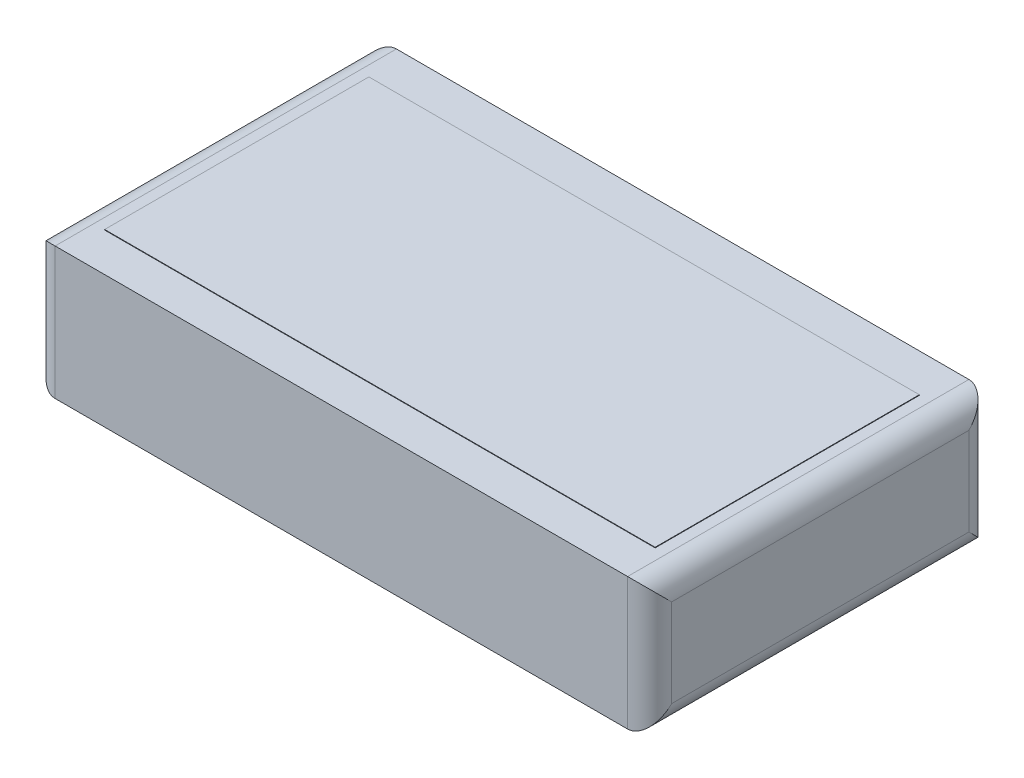
ISO-10303-21;
HEADER;
FILE_DESCRIPTION(('STEP AP214'),'2;1');
FILE_NAME('part.step','',(''),(''),'','','');
FILE_SCHEMA(('AUTOMOTIVE_DESIGN { 1 0 10303 214 1 1 1 1 }'));
ENDSEC;
DATA;
#1=APPLICATION_CONTEXT('core data for automotive mechanical design processes');
#2=APPLICATION_PROTOCOL_DEFINITION('international standard','automotive_design',2000,#1);
#3=PRODUCT_CONTEXT('',#1,'mechanical');
#4=PRODUCT('Part','Part','',(#3));
#5=PRODUCT_RELATED_PRODUCT_CATEGORY('part','',(#4));
#6=PRODUCT_DEFINITION_FORMATION('','',#4);
#7=PRODUCT_DEFINITION_CONTEXT('part definition',#1,'design');
#8=PRODUCT_DEFINITION('design','',#6,#7);
#9=PRODUCT_DEFINITION_SHAPE('','',#8);
#10=(LENGTH_UNIT() NAMED_UNIT(*) SI_UNIT(.MILLI.,.METRE.));
#11=(NAMED_UNIT(*) PLANE_ANGLE_UNIT() SI_UNIT($,.RADIAN.));
#12=(NAMED_UNIT(*) SI_UNIT($,.STERADIAN.) SOLID_ANGLE_UNIT());
#13=UNCERTAINTY_MEASURE_WITH_UNIT(LENGTH_MEASURE(1.E-05),#10,'distance_accuracy_value','');
#14=(GEOMETRIC_REPRESENTATION_CONTEXT(3) GLOBAL_UNCERTAINTY_ASSIGNED_CONTEXT((#13)) GLOBAL_UNIT_ASSIGNED_CONTEXT((#10,
#11,#12)) REPRESENTATION_CONTEXT('',''));
#15=CARTESIAN_POINT('',(0.,0.,0.));
#16=DIRECTION('',(0.,0.,1.));
#17=DIRECTION('',(1.,0.,0.));
#18=AXIS2_PLACEMENT_3D('',#15,#16,#17);
#19=CARTESIAN_POINT('',(-28.,6.,31.));
#20=DIRECTION('',(0.,-1.,0.));
#21=DIRECTION('',(0.,0.,-1.));
#22=AXIS2_PLACEMENT_3D('',#19,#20,#21);
#23=PLANE('',#22);
#24=DIRECTION('',(-1.,0.,0.));
#25=VECTOR('',#24,1.);
#26=CARTESIAN_POINT('',(-28.,6.,0.));
#27=LINE('',#26,#25);
#28=CARTESIAN_POINT('',(26.,6.,0.));
#29=VERTEX_POINT('',#28);
#30=CARTESIAN_POINT('',(-26.,6.,0.));
#31=VERTEX_POINT('',#30);
#32=EDGE_CURVE('E153',#29,#31,#27,.T.);
#33=ORIENTED_EDGE('',*,*,#32,.T.);
#34=DIRECTION('',(0.,0.,-1.));
#35=VECTOR('',#34,1.);
#36=CARTESIAN_POINT('',(-26.,6.,31.));
#37=LINE('',#36,#35);
#38=CARTESIAN_POINT('',(-26.,6.,31.));
#39=VERTEX_POINT('',#38);
#40=EDGE_CURVE('E206',#31,#39,#37,.F.);
#41=ORIENTED_EDGE('',*,*,#40,.T.);
#42=DIRECTION('',(-1.,0.,0.));
#43=VECTOR('',#42,1.);
#44=CARTESIAN_POINT('',(-28.,6.,31.));
#45=LINE('',#44,#43);
#46=CARTESIAN_POINT('',(26.,6.,31.));
#47=VERTEX_POINT('',#46);
#48=EDGE_CURVE('E162',#47,#39,#45,.T.);
#49=ORIENTED_EDGE('',*,*,#48,.F.);
#50=DIRECTION('',(0.,0.,-1.));
#51=VECTOR('',#50,1.);
#52=CARTESIAN_POINT('',(26.,6.,31.));
#53=LINE('',#52,#51);
#54=EDGE_CURVE('E181',#47,#29,#53,.T.);
#55=ORIENTED_EDGE('',*,*,#54,.T.);
#56=EDGE_LOOP('',(#33,#41,#49,#55));
#57=FACE_BOUND('',#56,.T.);
#58=DIRECTION('',(0.,0.,1.));
#59=VECTOR('',#58,1.);
#60=CARTESIAN_POINT('',(-25.,6.,3.5));
#61=LINE('',#60,#59);
#62=CARTESIAN_POINT('',(-25.,6.,3.5));
#63=VERTEX_POINT('',#62);
#64=CARTESIAN_POINT('',(-25.,6.,27.5));
#65=VERTEX_POINT('',#64);
#66=EDGE_CURVE('E152',#63,#65,#61,.T.);
#67=ORIENTED_EDGE('',*,*,#66,.F.);
#68=DIRECTION('',(-1.,0.,0.));
#69=VECTOR('',#68,1.);
#70=CARTESIAN_POINT('',(-25.,6.,3.5));
#71=LINE('',#70,#69);
#72=CARTESIAN_POINT('',(25.,6.,3.5));
#73=VERTEX_POINT('',#72);
#74=EDGE_CURVE('E149',#73,#63,#71,.T.);
#75=ORIENTED_EDGE('',*,*,#74,.F.);
#76=DIRECTION('',(0.,0.,-1.));
#77=VECTOR('',#76,1.);
#78=CARTESIAN_POINT('',(25.,6.,3.5));
#79=LINE('',#78,#77);
#80=CARTESIAN_POINT('',(25.,6.,27.5));
#81=VERTEX_POINT('',#80);
#82=EDGE_CURVE('E426',#81,#73,#79,.T.);
#83=ORIENTED_EDGE('',*,*,#82,.F.);
#84=DIRECTION('',(1.,0.,0.));
#85=VECTOR('',#84,1.);
#86=CARTESIAN_POINT('',(-25.,6.,27.5));
#87=LINE('',#86,#85);
#88=EDGE_CURVE('E428',#65,#81,#87,.T.);
#89=ORIENTED_EDGE('',*,*,#88,.F.);
#90=EDGE_LOOP('',(#67,#75,#83,#89));
#91=FACE_BOUND('',#90,.T.);
#92=ADVANCED_FACE('F38',(#57,#91),#23,.F.);
#93=CARTESIAN_POINT('',(28.,6.,31.));
#94=DIRECTION('',(-1.,0.,0.));
#95=DIRECTION('',(0.,0.,1.));
#96=AXIS2_PLACEMENT_3D('',#93,#94,#95);
#97=PLANE('',#96);
#98=DIRECTION('',(0.,1.,0.));
#99=VECTOR('',#98,1.);
#100=CARTESIAN_POINT('',(28.,6.,29.));
#101=LINE('',#100,#99);
#102=CARTESIAN_POINT('',(28.,4.,29.));
#103=VERTEX_POINT('',#102);
#104=CARTESIAN_POINT('',(28.,-4.,29.));
#105=VERTEX_POINT('',#104);
#106=EDGE_CURVE('E171',#103,#105,#101,.F.);
#107=ORIENTED_EDGE('',*,*,#106,.T.);
#108=DIRECTION('',(0.,0.,-1.));
#109=VECTOR('',#108,1.);
#110=CARTESIAN_POINT('',(28.,-4.,31.));
#111=LINE('',#110,#109);
#112=CARTESIAN_POINT('',(28.,-4.,2.));
#113=VERTEX_POINT('',#112);
#114=EDGE_CURVE('E173',#105,#113,#111,.T.);
#115=ORIENTED_EDGE('',*,*,#114,.T.);
#116=DIRECTION('',(0.,1.,0.));
#117=VECTOR('',#116,1.);
#118=CARTESIAN_POINT('',(28.,6.,2.));
#119=LINE('',#118,#117);
#120=CARTESIAN_POINT('',(28.,4.,2.));
#121=VERTEX_POINT('',#120);
#122=EDGE_CURVE('E165',#113,#121,#119,.T.);
#123=ORIENTED_EDGE('',*,*,#122,.T.);
#124=DIRECTION('',(0.,0.,-1.));
#125=VECTOR('',#124,1.);
#126=CARTESIAN_POINT('',(28.,4.,31.));
#127=LINE('',#126,#125);
#128=EDGE_CURVE('E169',#121,#103,#127,.F.);
#129=ORIENTED_EDGE('',*,*,#128,.T.);
#130=EDGE_LOOP('',(#107,#115,#123,#129));
#131=FACE_BOUND('',#130,.T.);
#132=ADVANCED_FACE('F246',(#131),#97,.F.);
#133=CARTESIAN_POINT('',(-28.,6.,31.));
#134=DIRECTION('',(1.,0.,0.));
#135=DIRECTION('',(0.,0.,-1.));
#136=AXIS2_PLACEMENT_3D('',#133,#134,#135);
#137=PLANE('',#136);
#138=DIRECTION('',(0.,-1.,0.));
#139=VECTOR('',#138,1.);
#140=CARTESIAN_POINT('',(-28.,6.,29.));
#141=LINE('',#140,#139);
#142=CARTESIAN_POINT('',(-28.,-4.,29.));
#143=VERTEX_POINT('',#142);
#144=CARTESIAN_POINT('',(-28.,4.,29.));
#145=VERTEX_POINT('',#144);
#146=EDGE_CURVE('E201',#143,#145,#141,.F.);
#147=ORIENTED_EDGE('',*,*,#146,.T.);
#148=DIRECTION('',(0.,0.,-1.));
#149=VECTOR('',#148,1.);
#150=CARTESIAN_POINT('',(-28.,4.,31.));
#151=LINE('',#150,#149);
#152=CARTESIAN_POINT('',(-28.,4.,2.));
#153=VERTEX_POINT('',#152);
#154=EDGE_CURVE('E203',#145,#153,#151,.T.);
#155=ORIENTED_EDGE('',*,*,#154,.T.);
#156=DIRECTION('',(0.,-1.,0.));
#157=VECTOR('',#156,1.);
#158=CARTESIAN_POINT('',(-28.,-6.,2.));
#159=LINE('',#158,#157);
#160=CARTESIAN_POINT('',(-28.,-4.,2.));
#161=VERTEX_POINT('',#160);
#162=EDGE_CURVE('E186',#153,#161,#159,.T.);
#163=ORIENTED_EDGE('',*,*,#162,.T.);
#164=DIRECTION('',(0.,0.,-1.));
#165=VECTOR('',#164,1.);
#166=CARTESIAN_POINT('',(-28.,-4.,31.));
#167=LINE('',#166,#165);
#168=EDGE_CURVE('E199',#161,#143,#167,.F.);
#169=ORIENTED_EDGE('',*,*,#168,.T.);
#170=EDGE_LOOP('',(#147,#155,#163,#169));
#171=FACE_BOUND('',#170,.T.);
#172=ADVANCED_FACE('F243',(#171),#137,.F.);
#173=CARTESIAN_POINT('',(28.,-6.,31.));
#174=DIRECTION('',(0.,1.,0.));
#175=DIRECTION('',(0.,0.,1.));
#176=AXIS2_PLACEMENT_3D('',#173,#174,#175);
#177=PLANE('',#176);
#178=DIRECTION('',(1.,0.,0.));
#179=VECTOR('',#178,1.);
#180=CARTESIAN_POINT('',(28.,-6.,31.));
#181=LINE('',#180,#179);
#182=CARTESIAN_POINT('',(-26.,-6.,31.));
#183=VERTEX_POINT('',#182);
#184=CARTESIAN_POINT('',(26.,-6.,31.));
#185=VERTEX_POINT('',#184);
#186=EDGE_CURVE('E164',#183,#185,#181,.T.);
#187=ORIENTED_EDGE('',*,*,#186,.F.);
#188=DIRECTION('',(0.,0.,-1.));
#189=VECTOR('',#188,1.);
#190=CARTESIAN_POINT('',(-26.,-6.,31.));
#191=LINE('',#190,#189);
#192=CARTESIAN_POINT('',(-26.,-6.,0.));
#193=VERTEX_POINT('',#192);
#194=EDGE_CURVE('E47',#183,#193,#191,.T.);
#195=ORIENTED_EDGE('',*,*,#194,.T.);
#196=DIRECTION('',(1.,0.,0.));
#197=VECTOR('',#196,1.);
#198=CARTESIAN_POINT('',(28.,-6.,0.));
#199=LINE('',#198,#197);
#200=CARTESIAN_POINT('',(26.,-6.,0.));
#201=VERTEX_POINT('',#200);
#202=EDGE_CURVE('E156',#193,#201,#199,.T.);
#203=ORIENTED_EDGE('',*,*,#202,.T.);
#204=DIRECTION('',(0.,0.,-1.));
#205=VECTOR('',#204,1.);
#206=CARTESIAN_POINT('',(26.,-6.,31.));
#207=LINE('',#206,#205);
#208=EDGE_CURVE('E176',#201,#185,#207,.F.);
#209=ORIENTED_EDGE('',*,*,#208,.T.);
#210=EDGE_LOOP('',(#187,#195,#203,#209));
#211=FACE_BOUND('',#210,.T.);
#212=ADVANCED_FACE('F245',(#211),#177,.F.);
#213=CARTESIAN_POINT('',(0.,0.,31.));
#214=DIRECTION('',(0.,0.,-1.));
#215=DIRECTION('',(-1.,0.,0.));
#216=AXIS2_PLACEMENT_3D('',#213,#214,#215);
#217=PLANE('',#216);
#218=ORIENTED_EDGE('',*,*,#48,.T.);
#219=DIRECTION('',(0.,-1.,0.));
#220=VECTOR('',#219,1.);
#221=CARTESIAN_POINT('',(-26.,0.,31.));
#222=LINE('',#221,#220);
#223=EDGE_CURVE('E62',#39,#183,#222,.T.);
#224=ORIENTED_EDGE('',*,*,#223,.T.);
#225=ORIENTED_EDGE('',*,*,#186,.T.);
#226=DIRECTION('',(0.,1.,0.));
#227=VECTOR('',#226,1.);
#228=CARTESIAN_POINT('',(26.,0.,31.));
#229=LINE('',#228,#227);
#230=EDGE_CURVE('E179',#185,#47,#229,.T.);
#231=ORIENTED_EDGE('',*,*,#230,.T.);
#232=EDGE_LOOP('',(#218,#224,#225,#231));
#233=FACE_BOUND('',#232,.T.);
#234=ADVANCED_FACE('F252',(#233),#217,.F.);
#235=CARTESIAN_POINT('',(0.,0.,0.));
#236=DIRECTION('',(0.,0.,-1.));
#237=DIRECTION('',(-1.,0.,0.));
#238=AXIS2_PLACEMENT_3D('',#235,#236,#237);
#239=PLANE('',#238);
#240=ORIENTED_EDGE('',*,*,#202,.F.);
#241=DIRECTION('',(0.,-1.,0.));
#242=VECTOR('',#241,1.);
#243=CARTESIAN_POINT('',(-26.,6.,0.));
#244=LINE('',#243,#242);
#245=EDGE_CURVE('E11',#193,#31,#244,.F.);
#246=ORIENTED_EDGE('',*,*,#245,.T.);
#247=ORIENTED_EDGE('',*,*,#32,.F.);
#248=DIRECTION('',(0.,1.,0.));
#249=VECTOR('',#248,1.);
#250=CARTESIAN_POINT('',(26.,-6.,0.));
#251=LINE('',#250,#249);
#252=EDGE_CURVE('E183',#29,#201,#251,.F.);
#253=ORIENTED_EDGE('',*,*,#252,.T.);
#254=EDGE_LOOP('',(#240,#246,#247,#253));
#255=FACE_BOUND('',#254,.T.);
#256=ADVANCED_FACE('F232',(#255),#239,.T.);
#257=CARTESIAN_POINT('',(-25.,6.05,3.5));
#258=DIRECTION('',(1.,0.,0.));
#259=DIRECTION('',(0.,0.,-1.));
#260=AXIS2_PLACEMENT_3D('',#257,#258,#259);
#261=PLANE('',#260);
#262=ORIENTED_EDGE('',*,*,#66,.T.);
#263=DIRECTION('',(0.,-1.,0.));
#264=VECTOR('',#263,1.);
#265=CARTESIAN_POINT('',(-25.,6.05,27.5));
#266=LINE('',#265,#264);
#267=CARTESIAN_POINT('',(-25.,6.05,27.5));
#268=VERTEX_POINT('',#267);
#269=EDGE_CURVE('E133',#268,#65,#266,.T.);
#270=ORIENTED_EDGE('',*,*,#269,.F.);
#271=DIRECTION('',(0.,0.,1.));
#272=VECTOR('',#271,1.);
#273=CARTESIAN_POINT('',(-25.,6.05,3.5));
#274=LINE('',#273,#272);
#275=CARTESIAN_POINT('',(-25.,6.05,3.5));
#276=VERTEX_POINT('',#275);
#277=EDGE_CURVE('E140',#276,#268,#274,.T.);
#278=ORIENTED_EDGE('',*,*,#277,.F.);
#279=DIRECTION('',(0.,-1.,0.));
#280=VECTOR('',#279,1.);
#281=CARTESIAN_POINT('',(-25.,6.05,3.5));
#282=LINE('',#281,#280);
#283=EDGE_CURVE('E431',#276,#63,#282,.T.);
#284=ORIENTED_EDGE('',*,*,#283,.T.);
#285=EDGE_LOOP('',(#262,#270,#278,#284));
#286=FACE_BOUND('',#285,.T.);
#287=ADVANCED_FACE('F151',(#286),#261,.F.);
#288=CARTESIAN_POINT('',(-25.,6.05,27.5));
#289=DIRECTION('',(0.,0.,-1.));
#290=DIRECTION('',(-1.,0.,0.));
#291=AXIS2_PLACEMENT_3D('',#288,#289,#290);
#292=PLANE('',#291);
#293=ORIENTED_EDGE('',*,*,#88,.T.);
#294=DIRECTION('',(0.,-1.,0.));
#295=VECTOR('',#294,1.);
#296=CARTESIAN_POINT('',(25.,6.05,27.5));
#297=LINE('',#296,#295);
#298=CARTESIAN_POINT('',(25.,6.05,27.5));
#299=VERTEX_POINT('',#298);
#300=EDGE_CURVE('E136',#299,#81,#297,.T.);
#301=ORIENTED_EDGE('',*,*,#300,.F.);
#302=DIRECTION('',(1.,0.,0.));
#303=VECTOR('',#302,1.);
#304=CARTESIAN_POINT('',(-25.,6.05,27.5));
#305=LINE('',#304,#303);
#306=EDGE_CURVE('E128',#268,#299,#305,.T.);
#307=ORIENTED_EDGE('',*,*,#306,.F.);
#308=ORIENTED_EDGE('',*,*,#269,.T.);
#309=EDGE_LOOP('',(#293,#301,#307,#308));
#310=FACE_BOUND('',#309,.T.);
#311=ADVANCED_FACE('F131',(#310),#292,.F.);
#312=CARTESIAN_POINT('',(25.,6.05,3.5));
#313=DIRECTION('',(-1.,0.,0.));
#314=DIRECTION('',(0.,0.,1.));
#315=AXIS2_PLACEMENT_3D('',#312,#313,#314);
#316=PLANE('',#315);
#317=ORIENTED_EDGE('',*,*,#82,.T.);
#318=DIRECTION('',(0.,-1.,0.));
#319=VECTOR('',#318,1.);
#320=CARTESIAN_POINT('',(25.,6.05,3.5));
#321=LINE('',#320,#319);
#322=CARTESIAN_POINT('',(25.,6.05,3.5));
#323=VERTEX_POINT('',#322);
#324=EDGE_CURVE('E158',#323,#73,#321,.T.);
#325=ORIENTED_EDGE('',*,*,#324,.F.);
#326=DIRECTION('',(0.,0.,-1.));
#327=VECTOR('',#326,1.);
#328=CARTESIAN_POINT('',(25.,6.05,3.5));
#329=LINE('',#328,#327);
#330=EDGE_CURVE('E139',#299,#323,#329,.T.);
#331=ORIENTED_EDGE('',*,*,#330,.F.);
#332=ORIENTED_EDGE('',*,*,#300,.T.);
#333=EDGE_LOOP('',(#317,#325,#331,#332));
#334=FACE_BOUND('',#333,.T.);
#335=ADVANCED_FACE('F318',(#334),#316,.F.);
#336=CARTESIAN_POINT('',(-25.,6.05,3.5));
#337=DIRECTION('',(0.,0.,1.));
#338=DIRECTION('',(1.,0.,0.));
#339=AXIS2_PLACEMENT_3D('',#336,#337,#338);
#340=PLANE('',#339);
#341=ORIENTED_EDGE('',*,*,#74,.T.);
#342=ORIENTED_EDGE('',*,*,#283,.F.);
#343=DIRECTION('',(-1.,0.,0.));
#344=VECTOR('',#343,1.);
#345=CARTESIAN_POINT('',(-25.,6.05,3.5));
#346=LINE('',#345,#344);
#347=EDGE_CURVE('E145',#323,#276,#346,.T.);
#348=ORIENTED_EDGE('',*,*,#347,.F.);
#349=ORIENTED_EDGE('',*,*,#324,.T.);
#350=EDGE_LOOP('',(#341,#342,#348,#349));
#351=FACE_BOUND('',#350,.T.);
#352=ADVANCED_FACE('F311',(#351),#340,.F.);
#353=CARTESIAN_POINT('',(0.,6.05,0.));
#354=DIRECTION('',(0.,1.,0.));
#355=DIRECTION('',(0.,0.,1.));
#356=AXIS2_PLACEMENT_3D('',#353,#354,#355);
#357=PLANE('',#356);
#358=ORIENTED_EDGE('',*,*,#277,.T.);
#359=ORIENTED_EDGE('',*,*,#306,.T.);
#360=ORIENTED_EDGE('',*,*,#330,.T.);
#361=ORIENTED_EDGE('',*,*,#347,.T.);
#362=EDGE_LOOP('',(#358,#359,#360,#361));
#363=FACE_BOUND('',#362,.T.);
#364=ADVANCED_FACE('F143',(#363),#357,.T.);
#365=CARTESIAN_POINT('',(26.,4.,31.));
#366=DIRECTION('',(0.,0.,-1.));
#367=DIRECTION('',(-1.,0.,0.));
#368=AXIS2_PLACEMENT_3D('',#365,#366,#367);
#369=CYLINDRICAL_SURFACE('',#368,2.);
#370=CARTESIAN_POINT('',(26.,4.,2.));
#371=DIRECTION('',(0.,-0.707106781186547,-0.707106781186547));
#372=DIRECTION('',(0.,-0.707106781186547,0.707106781186547));
#373=AXIS2_PLACEMENT_3D('',#370,#371,#372);
#374=ELLIPSE('',#373,2.82842712474619,2.);
#375=EDGE_CURVE('E192',#29,#121,#374,.T.);
#376=ORIENTED_EDGE('',*,*,#375,.F.);
#377=ORIENTED_EDGE('',*,*,#54,.F.);
#378=CARTESIAN_POINT('',(26.,4.,29.));
#379=DIRECTION('',(0.,0.707106781186547,-0.707106781186547));
#380=DIRECTION('',(0.,-0.707106781186547,-0.707106781186547));
#381=AXIS2_PLACEMENT_3D('',#378,#379,#380);
#382=ELLIPSE('',#381,2.82842712474619,2.);
#383=EDGE_CURVE('E195',#103,#47,#382,.F.);
#384=ORIENTED_EDGE('',*,*,#383,.F.);
#385=ORIENTED_EDGE('',*,*,#128,.F.);
#386=EDGE_LOOP('',(#376,#377,#384,#385));
#387=FACE_BOUND('',#386,.T.);
#388=ADVANCED_FACE('F272',(#387),#369,.T.);
#389=CARTESIAN_POINT('',(26.,0.,29.));
#390=DIRECTION('',(0.,1.,0.));
#391=DIRECTION('',(0.,0.,1.));
#392=AXIS2_PLACEMENT_3D('',#389,#390,#391);
#393=CYLINDRICAL_SURFACE('',#392,2.);
#394=ORIENTED_EDGE('',*,*,#383,.T.);
#395=ORIENTED_EDGE('',*,*,#230,.F.);
#396=CARTESIAN_POINT('',(26.,-4.,29.));
#397=DIRECTION('',(0.,0.707106781186547,0.707106781186547));
#398=DIRECTION('',(0.,0.707106781186547,-0.707106781186547));
#399=AXIS2_PLACEMENT_3D('',#396,#397,#398);
#400=ELLIPSE('',#399,2.82842712474619,2.);
#401=EDGE_CURVE('E189',#105,#185,#400,.F.);
#402=ORIENTED_EDGE('',*,*,#401,.F.);
#403=ORIENTED_EDGE('',*,*,#106,.F.);
#404=EDGE_LOOP('',(#394,#395,#402,#403));
#405=FACE_BOUND('',#404,.T.);
#406=ADVANCED_FACE('F268',(#405),#393,.T.);
#407=CARTESIAN_POINT('',(26.,6.,2.));
#408=DIRECTION('',(0.,-1.,0.));
#409=DIRECTION('',(0.,0.,-1.));
#410=AXIS2_PLACEMENT_3D('',#407,#408,#409);
#411=CYLINDRICAL_SURFACE('',#410,2.);
#412=ORIENTED_EDGE('',*,*,#375,.T.);
#413=ORIENTED_EDGE('',*,*,#122,.F.);
#414=CARTESIAN_POINT('',(26.,-4.,2.));
#415=DIRECTION('',(0.,-0.707106781186547,0.707106781186547));
#416=DIRECTION('',(0.,-0.707106781186547,-0.707106781186547));
#417=AXIS2_PLACEMENT_3D('',#414,#415,#416);
#418=ELLIPSE('',#417,2.82842712474619,2.);
#419=EDGE_CURVE('E187',#201,#113,#418,.T.);
#420=ORIENTED_EDGE('',*,*,#419,.F.);
#421=ORIENTED_EDGE('',*,*,#252,.F.);
#422=EDGE_LOOP('',(#412,#413,#420,#421));
#423=FACE_BOUND('',#422,.T.);
#424=ADVANCED_FACE('F264',(#423),#411,.T.);
#425=CARTESIAN_POINT('',(26.,-4.,31.));
#426=DIRECTION('',(0.,0.,-1.));
#427=DIRECTION('',(-1.,0.,0.));
#428=AXIS2_PLACEMENT_3D('',#425,#426,#427);
#429=CYLINDRICAL_SURFACE('',#428,2.);
#430=ORIENTED_EDGE('',*,*,#401,.T.);
#431=ORIENTED_EDGE('',*,*,#208,.F.);
#432=ORIENTED_EDGE('',*,*,#419,.T.);
#433=ORIENTED_EDGE('',*,*,#114,.F.);
#434=EDGE_LOOP('',(#430,#431,#432,#433));
#435=FACE_BOUND('',#434,.T.);
#436=ADVANCED_FACE('F261',(#435),#429,.T.);
#437=CARTESIAN_POINT('',(-26.,-4.,31.));
#438=DIRECTION('',(0.,0.,-1.));
#439=DIRECTION('',(-1.,0.,0.));
#440=AXIS2_PLACEMENT_3D('',#437,#438,#439);
#441=CYLINDRICAL_SURFACE('',#440,2.);
#442=CARTESIAN_POINT('',(-26.,-4.,2.));
#443=DIRECTION('',(0.,0.707106781186547,-0.707106781186547));
#444=DIRECTION('',(0.,0.707106781186547,0.707106781186547));
#445=AXIS2_PLACEMENT_3D('',#442,#443,#444);
#446=ELLIPSE('',#445,2.82842712474619,2.);
#447=EDGE_CURVE('E214',#193,#161,#446,.T.);
#448=ORIENTED_EDGE('',*,*,#447,.F.);
#449=ORIENTED_EDGE('',*,*,#194,.F.);
#450=CARTESIAN_POINT('',(-26.,-4.,29.));
#451=DIRECTION('',(0.,-0.707106781186547,-0.707106781186547));
#452=DIRECTION('',(0.,0.707106781186547,-0.707106781186547));
#453=AXIS2_PLACEMENT_3D('',#450,#451,#452);
#454=ELLIPSE('',#453,2.82842712474619,2.);
#455=EDGE_CURVE('E42',#143,#183,#454,.F.);
#456=ORIENTED_EDGE('',*,*,#455,.F.);
#457=ORIENTED_EDGE('',*,*,#168,.F.);
#458=EDGE_LOOP('',(#448,#449,#456,#457));
#459=FACE_BOUND('',#458,.T.);
#460=ADVANCED_FACE('F40',(#459),#441,.T.);
#461=CARTESIAN_POINT('',(-26.,0.,29.));
#462=DIRECTION('',(0.,-1.,0.));
#463=DIRECTION('',(0.,0.,-1.));
#464=AXIS2_PLACEMENT_3D('',#461,#462,#463);
#465=CYLINDRICAL_SURFACE('',#464,2.);
#466=ORIENTED_EDGE('',*,*,#455,.T.);
#467=ORIENTED_EDGE('',*,*,#223,.F.);
#468=CARTESIAN_POINT('',(-26.,4.,29.));
#469=DIRECTION('',(0.,-0.707106781186547,0.707106781186547));
#470=DIRECTION('',(0.,-0.707106781186547,-0.707106781186547));
#471=AXIS2_PLACEMENT_3D('',#468,#469,#470);
#472=ELLIPSE('',#471,2.82842712474619,2.);
#473=EDGE_CURVE('E213',#145,#39,#472,.F.);
#474=ORIENTED_EDGE('',*,*,#473,.F.);
#475=ORIENTED_EDGE('',*,*,#146,.F.);
#476=EDGE_LOOP('',(#466,#467,#474,#475));
#477=FACE_BOUND('',#476,.T.);
#478=ADVANCED_FACE('F224',(#477),#465,.T.);
#479=CARTESIAN_POINT('',(-26.,6.,2.));
#480=DIRECTION('',(0.,1.,0.));
#481=DIRECTION('',(0.,0.,1.));
#482=AXIS2_PLACEMENT_3D('',#479,#480,#481);
#483=CYLINDRICAL_SURFACE('',#482,2.);
#484=ORIENTED_EDGE('',*,*,#447,.T.);
#485=ORIENTED_EDGE('',*,*,#162,.F.);
#486=CARTESIAN_POINT('',(-26.,4.,2.));
#487=DIRECTION('',(0.,0.707106781186547,0.707106781186547));
#488=DIRECTION('',(0.,0.707106781186547,-0.707106781186547));
#489=AXIS2_PLACEMENT_3D('',#486,#487,#488);
#490=ELLIPSE('',#489,2.82842712474619,2.);
#491=EDGE_CURVE('E211',#31,#153,#490,.T.);
#492=ORIENTED_EDGE('',*,*,#491,.F.);
#493=ORIENTED_EDGE('',*,*,#245,.F.);
#494=EDGE_LOOP('',(#484,#485,#492,#493));
#495=FACE_BOUND('',#494,.T.);
#496=ADVANCED_FACE('F229',(#495),#483,.T.);
#497=CARTESIAN_POINT('',(-26.,4.,31.));
#498=DIRECTION('',(0.,0.,-1.));
#499=DIRECTION('',(-1.,0.,0.));
#500=AXIS2_PLACEMENT_3D('',#497,#498,#499);
#501=CYLINDRICAL_SURFACE('',#500,2.);
#502=ORIENTED_EDGE('',*,*,#473,.T.);
#503=ORIENTED_EDGE('',*,*,#40,.F.);
#504=ORIENTED_EDGE('',*,*,#491,.T.);
#505=ORIENTED_EDGE('',*,*,#154,.F.);
#506=EDGE_LOOP('',(#502,#503,#504,#505));
#507=FACE_BOUND('',#506,.T.);
#508=ADVANCED_FACE('F240',(#507),#501,.T.);
#509=CLOSED_SHELL('',(#92,#132,#172,#212,#234,#256,#287,#311,#335,#352,#364,#388,#406,#424,#436,
#460,#478,#496,#508));
#510=MANIFOLD_SOLID_BREP('B2',#509);
#511=ADVANCED_BREP_SHAPE_REPRESENTATION('',(#18,#510),#14);
#512=SHAPE_DEFINITION_REPRESENTATION(#9,#511);
ENDSEC;
END-ISO-10303-21;
